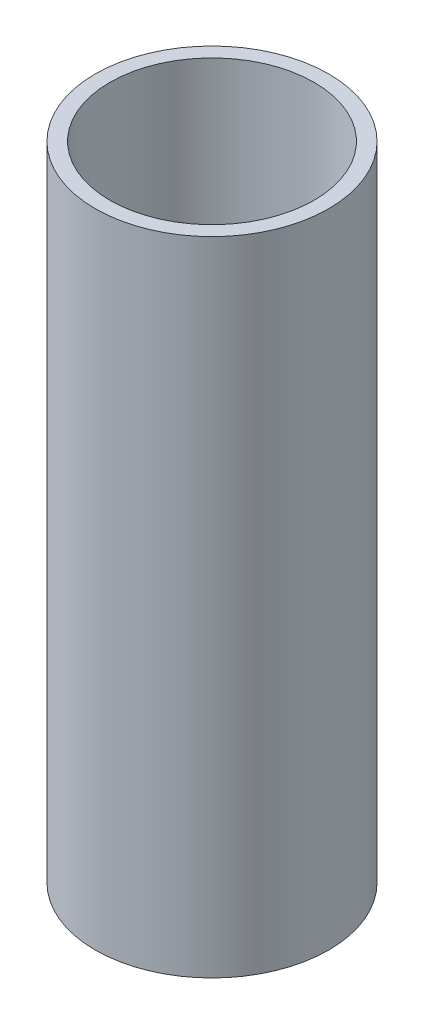
ISO-10303-21;
HEADER;
FILE_DESCRIPTION(('STEP AP214'),'2;1');
FILE_NAME('part.step','',(''),(''),'','','');
FILE_SCHEMA(('AUTOMOTIVE_DESIGN { 1 0 10303 214 1 1 1 1 }'));
ENDSEC;
DATA;
#1=APPLICATION_CONTEXT('core data for automotive mechanical design processes');
#2=APPLICATION_PROTOCOL_DEFINITION('international standard','automotive_design',2000,#1);
#3=PRODUCT_CONTEXT('',#1,'mechanical');
#4=PRODUCT('Part','Part','',(#3));
#5=PRODUCT_RELATED_PRODUCT_CATEGORY('part','',(#4));
#6=PRODUCT_DEFINITION_FORMATION('','',#4);
#7=PRODUCT_DEFINITION_CONTEXT('part definition',#1,'design');
#8=PRODUCT_DEFINITION('design','',#6,#7);
#9=PRODUCT_DEFINITION_SHAPE('','',#8);
#10=(LENGTH_UNIT() NAMED_UNIT(*) SI_UNIT(.MILLI.,.METRE.));
#11=(NAMED_UNIT(*) PLANE_ANGLE_UNIT() SI_UNIT($,.RADIAN.));
#12=(NAMED_UNIT(*) SI_UNIT($,.STERADIAN.) SOLID_ANGLE_UNIT());
#13=UNCERTAINTY_MEASURE_WITH_UNIT(LENGTH_MEASURE(1.E-05),#10,'distance_accuracy_value','');
#14=(GEOMETRIC_REPRESENTATION_CONTEXT(3) GLOBAL_UNCERTAINTY_ASSIGNED_CONTEXT((#13)) GLOBAL_UNIT_ASSIGNED_CONTEXT((#10,
#11,#12)) REPRESENTATION_CONTEXT('',''));
#15=CARTESIAN_POINT('',(0.,0.,0.));
#16=DIRECTION('',(0.,0.,1.));
#17=DIRECTION('',(1.,0.,0.));
#18=AXIS2_PLACEMENT_3D('',#15,#16,#17);
#19=CARTESIAN_POINT('',(0.,105.,0.));
#20=DIRECTION('',(0.,1.,0.));
#21=DIRECTION('',(0.,0.,1.));
#22=AXIS2_PLACEMENT_3D('',#19,#20,#21);
#23=PLANE('',#22);
#24=CARTESIAN_POINT('',(0.,105.,0.));
#25=DIRECTION('',(0.,1.,0.));
#26=DIRECTION('',(0.,0.,1.));
#27=AXIS2_PLACEMENT_3D('',#24,#25,#26);
#28=CIRCLE('',#27,20.);
#29=CARTESIAN_POINT('',(0.,105.,20.));
#30=VERTEX_POINT('',#29);
#31=EDGE_CURVE('E10',#30,#30,#28,.T.);
#32=ORIENTED_EDGE('',*,*,#31,.T.);
#33=EDGE_LOOP('',(#32));
#34=FACE_BOUND('',#33,.T.);
#35=CARTESIAN_POINT('',(0.,105.,0.));
#36=DIRECTION('',(0.,1.,0.));
#37=DIRECTION('',(0.,0.,1.));
#38=AXIS2_PLACEMENT_3D('',#35,#36,#37);
#39=CIRCLE('',#38,17.5);
#40=CARTESIAN_POINT('',(0.,105.,17.5));
#41=VERTEX_POINT('',#40);
#42=EDGE_CURVE('E38',#41,#41,#39,.T.);
#43=ORIENTED_EDGE('',*,*,#42,.F.);
#44=EDGE_LOOP('',(#43));
#45=FACE_BOUND('',#44,.T.);
#46=ADVANCED_FACE('F31',(#34,#45),#23,.T.);
#47=CARTESIAN_POINT('',(0.,105.,0.));
#48=DIRECTION('',(0.,-1.,0.));
#49=DIRECTION('',(0.,0.,-1.));
#50=AXIS2_PLACEMENT_3D('',#47,#48,#49);
#51=CYLINDRICAL_SURFACE('',#50,20.);
#52=ORIENTED_EDGE('',*,*,#31,.F.);
#53=EDGE_LOOP('',(#52));
#54=FACE_BOUND('',#53,.T.);
#55=CARTESIAN_POINT('',(0.,-5.,0.));
#56=DIRECTION('',(0.,-1.,0.));
#57=DIRECTION('',(0.,0.,-1.));
#58=AXIS2_PLACEMENT_3D('',#55,#56,#57);
#59=CIRCLE('',#58,20.);
#60=CARTESIAN_POINT('',(0.,-5.,-20.));
#61=VERTEX_POINT('',#60);
#62=EDGE_CURVE('E47',#61,#61,#59,.T.);
#63=ORIENTED_EDGE('',*,*,#62,.F.);
#64=EDGE_LOOP('',(#63));
#65=FACE_BOUND('',#64,.T.);
#66=ADVANCED_FACE('F33',(#54,#65),#51,.T.);
#67=CARTESIAN_POINT('',(0.,105.,0.));
#68=DIRECTION('',(0.,-1.,0.));
#69=DIRECTION('',(0.,0.,-1.));
#70=AXIS2_PLACEMENT_3D('',#67,#68,#69);
#71=CYLINDRICAL_SURFACE('',#70,17.5);
#72=ORIENTED_EDGE('',*,*,#42,.T.);
#73=EDGE_LOOP('',(#72));
#74=FACE_BOUND('',#73,.T.);
#75=CARTESIAN_POINT('',(0.,0.,0.));
#76=DIRECTION('',(0.,1.,0.));
#77=DIRECTION('',(0.,0.,1.));
#78=AXIS2_PLACEMENT_3D('',#75,#76,#77);
#79=CIRCLE('',#78,17.5);
#80=CARTESIAN_POINT('',(0.,0.,17.5));
#81=VERTEX_POINT('',#80);
#82=EDGE_CURVE('E42',#81,#81,#79,.T.);
#83=ORIENTED_EDGE('',*,*,#82,.F.);
#84=EDGE_LOOP('',(#83));
#85=FACE_BOUND('',#84,.T.);
#86=ADVANCED_FACE('F55',(#74,#85),#71,.F.);
#87=CARTESIAN_POINT('',(0.,0.,0.));
#88=DIRECTION('',(0.,-1.,0.));
#89=DIRECTION('',(0.,0.,-1.));
#90=AXIS2_PLACEMENT_3D('',#87,#88,#89);
#91=PLANE('',#90);
#92=ORIENTED_EDGE('',*,*,#82,.T.);
#93=EDGE_LOOP('',(#92));
#94=FACE_BOUND('',#93,.T.);
#95=ADVANCED_FACE('F61',(#94),#91,.F.);
#96=CARTESIAN_POINT('',(0.,-5.,0.));
#97=DIRECTION('',(0.,-1.,0.));
#98=DIRECTION('',(0.,0.,-1.));
#99=AXIS2_PLACEMENT_3D('',#96,#97,#98);
#100=PLANE('',#99);
#101=ORIENTED_EDGE('',*,*,#62,.T.);
#102=EDGE_LOOP('',(#101));
#103=FACE_BOUND('',#102,.T.);
#104=ADVANCED_FACE('F52',(#103),#100,.T.);
#105=CLOSED_SHELL('',(#46,#66,#86,#95,#104));
#106=MANIFOLD_SOLID_BREP('B2',#105);
#107=ADVANCED_BREP_SHAPE_REPRESENTATION('',(#18,#106),#14);
#108=SHAPE_DEFINITION_REPRESENTATION(#9,#107);
ENDSEC;
END-ISO-10303-21;
